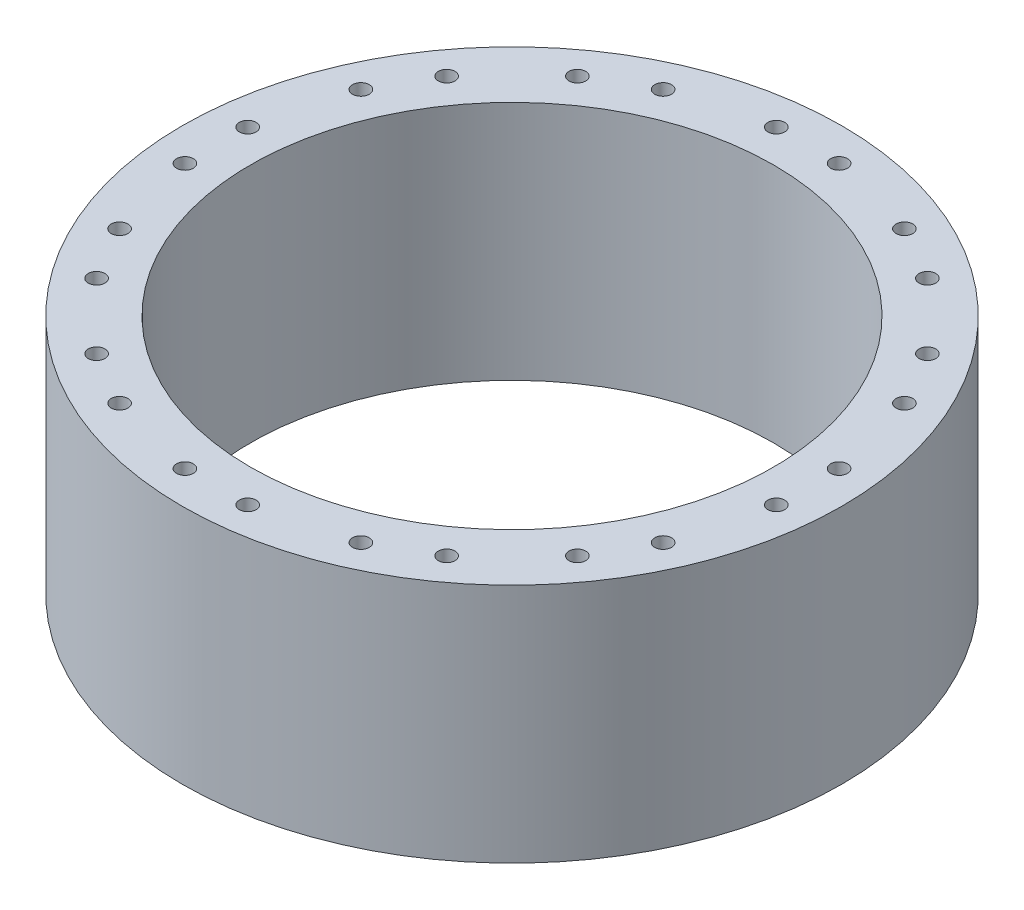
ISO-10303-21;
HEADER;
FILE_DESCRIPTION(('STEP AP214'),'2;1');
FILE_NAME('part.step','',(''),(''),'','','');
FILE_SCHEMA(('AUTOMOTIVE_DESIGN { 1 0 10303 214 1 1 1 1 }'));
ENDSEC;
DATA;
#1=APPLICATION_CONTEXT('core data for automotive mechanical design processes');
#2=APPLICATION_PROTOCOL_DEFINITION('international standard','automotive_design',2000,#1);
#3=PRODUCT_CONTEXT('',#1,'mechanical');
#4=PRODUCT('Part','Part','',(#3));
#5=PRODUCT_RELATED_PRODUCT_CATEGORY('part','',(#4));
#6=PRODUCT_DEFINITION_FORMATION('','',#4);
#7=PRODUCT_DEFINITION_CONTEXT('part definition',#1,'design');
#8=PRODUCT_DEFINITION('design','',#6,#7);
#9=PRODUCT_DEFINITION_SHAPE('','',#8);
#10=(LENGTH_UNIT() NAMED_UNIT(*) SI_UNIT(.MILLI.,.METRE.));
#11=(NAMED_UNIT(*) PLANE_ANGLE_UNIT() SI_UNIT($,.RADIAN.));
#12=(NAMED_UNIT(*) SI_UNIT($,.STERADIAN.) SOLID_ANGLE_UNIT());
#13=UNCERTAINTY_MEASURE_WITH_UNIT(LENGTH_MEASURE(1.E-05),#10,'distance_accuracy_value','');
#14=(GEOMETRIC_REPRESENTATION_CONTEXT(3) GLOBAL_UNCERTAINTY_ASSIGNED_CONTEXT((#13)) GLOBAL_UNIT_ASSIGNED_CONTEXT((#10,
#11,#12)) REPRESENTATION_CONTEXT('',''));
#15=CARTESIAN_POINT('',(0.,0.,0.));
#16=DIRECTION('',(0.,0.,1.));
#17=DIRECTION('',(1.,0.,0.));
#18=AXIS2_PLACEMENT_3D('',#15,#16,#17);
#19=CARTESIAN_POINT('',(0.,105.,0.));
#20=DIRECTION('',(0.,1.,0.));
#21=DIRECTION('',(0.,0.,1.));
#22=AXIS2_PLACEMENT_3D('',#19,#20,#21);
#23=PLANE('',#22);
#24=CARTESIAN_POINT('',(-83.6153810567697,105.,-114.82608828455));
#25=DIRECTION('',(0.,-1.,0.));
#26=DIRECTION('',(0.500000000000001,0.,0.866025403784438));
#27=AXIS2_PLACEMENT_3D('',#24,#25,#26);
#28=CIRCLE('',#27,4.00000000000001);
#29=CARTESIAN_POINT('',(-81.6153810567697,105.,-111.361986669412));
#30=VERTEX_POINT('',#29);
#31=EDGE_CURVE('E71',#30,#30,#28,.T.);
#32=ORIENTED_EDGE('',*,*,#31,.T.);
#33=EDGE_LOOP('',(#32));
#34=FACE_BOUND('',#33,.T.);
#35=CARTESIAN_POINT('',(-114.826088284554,105.,-83.6153810567633));
#36=DIRECTION('',(0.,-1.,0.));
#37=DIRECTION('',(-0.86602540378444,0.,-0.499999999999998));
#38=AXIS2_PLACEMENT_3D('',#35,#36,#37);
#39=CIRCLE('',#38,4.00000000000001);
#40=CARTESIAN_POINT('',(-118.290189899692,105.,-85.6153810567633));
#41=VERTEX_POINT('',#40);
#42=EDGE_CURVE('E162',#41,#41,#39,.T.);
#43=ORIENTED_EDGE('',*,*,#42,.T.);
#44=EDGE_LOOP('',(#43));
#45=FACE_BOUND('',#44,.T.);
#46=CARTESIAN_POINT('',(-129.826088284554,105.,-57.6346189432301));
#47=DIRECTION('',(0.,-1.,0.));
#48=DIRECTION('',(0.86602540378444,0.,0.499999999999998));
#49=AXIS2_PLACEMENT_3D('',#46,#47,#48);
#50=CIRCLE('',#49,4.00000000000001);
#51=CARTESIAN_POINT('',(-126.361986669416,105.,-55.6346189432302));
#52=VERTEX_POINT('',#51);
#53=EDGE_CURVE('E156',#52,#52,#50,.T.);
#54=ORIENTED_EDGE('',*,*,#53,.T.);
#55=EDGE_LOOP('',(#54));
#56=FACE_BOUND('',#55,.T.);
#57=CARTESIAN_POINT('',(-141.25,105.,-14.9999999999961));
#58=DIRECTION('',(0.,-1.,0.));
#59=DIRECTION('',(-1.,0.,0.));
#60=AXIS2_PLACEMENT_3D('',#57,#58,#59);
#61=CIRCLE('',#60,4.00000000000001);
#62=CARTESIAN_POINT('',(-145.25,105.,-14.9999999999961));
#63=VERTEX_POINT('',#62);
#64=EDGE_CURVE('E150',#63,#63,#61,.T.);
#65=ORIENTED_EDGE('',*,*,#64,.T.);
#66=EDGE_LOOP('',(#65));
#67=FACE_BOUND('',#66,.T.);
#68=CARTESIAN_POINT('',(-141.25,105.,15.0000000000039));
#69=DIRECTION('',(0.,-1.,0.));
#70=DIRECTION('',(1.,0.,0.));
#71=AXIS2_PLACEMENT_3D('',#68,#69,#70);
#72=CIRCLE('',#71,4.00000000000001);
#73=CARTESIAN_POINT('',(-137.25,105.,15.0000000000039));
#74=VERTEX_POINT('',#73);
#75=EDGE_CURVE('E144',#74,#74,#72,.T.);
#76=ORIENTED_EDGE('',*,*,#75,.T.);
#77=EDGE_LOOP('',(#76));
#78=FACE_BOUND('',#77,.T.);
#79=CARTESIAN_POINT('',(-129.82608828455,105.,57.634618943237));
#80=DIRECTION('',(0.,-1.,0.));
#81=DIRECTION('',(-0.866025403784436,0.,0.500000000000004));
#82=AXIS2_PLACEMENT_3D('',#79,#80,#81);
#83=CIRCLE('',#82,4.00000000000001);
#84=CARTESIAN_POINT('',(-133.290189899688,105.,59.634618943237));
#85=VERTEX_POINT('',#84);
#86=EDGE_CURVE('E138',#85,#85,#83,.T.);
#87=ORIENTED_EDGE('',*,*,#86,.T.);
#88=EDGE_LOOP('',(#87));
#89=FACE_BOUND('',#88,.T.);
#90=CARTESIAN_POINT('',(-114.82608828455,105.,83.6153810567701));
#91=DIRECTION('',(0.,-1.,0.));
#92=DIRECTION('',(0.866025403784436,0.,-0.500000000000004));
#93=AXIS2_PLACEMENT_3D('',#90,#91,#92);
#94=CIRCLE('',#93,4.00000000000001);
#95=CARTESIAN_POINT('',(-111.361986669412,105.,81.6153810567701));
#96=VERTEX_POINT('',#95);
#97=EDGE_CURVE('E132',#96,#96,#94,.T.);
#98=ORIENTED_EDGE('',*,*,#97,.T.);
#99=EDGE_LOOP('',(#98));
#100=FACE_BOUND('',#99,.T.);
#101=CARTESIAN_POINT('',(-83.6153810567629,105.,114.826088284554));
#102=DIRECTION('',(0.,-1.,0.));
#103=DIRECTION('',(-0.499999999999995,0.,0.866025403784442));
#104=AXIS2_PLACEMENT_3D('',#101,#102,#103);
#105=CIRCLE('',#104,4.00000000000001);
#106=CARTESIAN_POINT('',(-85.6153810567629,105.,118.290189899692));
#107=VERTEX_POINT('',#106);
#108=EDGE_CURVE('E126',#107,#107,#105,.T.);
#109=ORIENTED_EDGE('',*,*,#108,.T.);
#110=EDGE_LOOP('',(#109));
#111=FACE_BOUND('',#110,.T.);
#112=CARTESIAN_POINT('',(-57.6346189432297,105.,129.826088284554));
#113=DIRECTION('',(0.,-1.,0.));
#114=DIRECTION('',(0.499999999999995,0.,-0.866025403784442));
#115=AXIS2_PLACEMENT_3D('',#112,#113,#114);
#116=CIRCLE('',#115,4.00000000000001);
#117=CARTESIAN_POINT('',(-55.6346189432297,105.,126.361986669416));
#118=VERTEX_POINT('',#117);
#119=EDGE_CURVE('E120',#118,#118,#116,.T.);
#120=ORIENTED_EDGE('',*,*,#119,.T.);
#121=EDGE_LOOP('',(#120));
#122=FACE_BOUND('',#121,.T.);
#123=CARTESIAN_POINT('',(-14.9999999999966,105.,141.25));
#124=DIRECTION('',(0.,-1.,0.));
#125=DIRECTION('',(0.,0.,1.));
#126=AXIS2_PLACEMENT_3D('',#123,#124,#125);
#127=CIRCLE('',#126,4.00000000000001);
#128=CARTESIAN_POINT('',(-14.9999999999966,105.,145.25));
#129=VERTEX_POINT('',#128);
#130=EDGE_CURVE('E114',#129,#129,#127,.T.);
#131=ORIENTED_EDGE('',*,*,#130,.T.);
#132=EDGE_LOOP('',(#131));
#133=FACE_BOUND('',#132,.T.);
#134=CARTESIAN_POINT('',(15.0000000000034,105.,141.25));
#135=DIRECTION('',(0.,-1.,0.));
#136=DIRECTION('',(0.,0.,-1.));
#137=AXIS2_PLACEMENT_3D('',#134,#135,#136);
#138=CIRCLE('',#137,4.00000000000001);
#139=CARTESIAN_POINT('',(15.0000000000034,105.,137.25));
#140=VERTEX_POINT('',#139);
#141=EDGE_CURVE('E108',#140,#140,#138,.T.);
#142=ORIENTED_EDGE('',*,*,#141,.T.);
#143=EDGE_LOOP('',(#142));
#144=FACE_BOUND('',#143,.T.);
#145=CARTESIAN_POINT('',(57.6346189432374,105.,129.82608828455));
#146=DIRECTION('',(0.,-1.,0.));
#147=DIRECTION('',(0.500000000000007,0.,0.866025403784435));
#148=AXIS2_PLACEMENT_3D('',#145,#146,#147);
#149=CIRCLE('',#148,4.00000000000001);
#150=CARTESIAN_POINT('',(59.6346189432375,105.,133.290189899688));
#151=VERTEX_POINT('',#150);
#152=EDGE_CURVE('E102',#151,#151,#149,.T.);
#153=ORIENTED_EDGE('',*,*,#152,.T.);
#154=EDGE_LOOP('',(#153));
#155=FACE_BOUND('',#154,.T.);
#156=CARTESIAN_POINT('',(83.6153810567705,105.,114.82608828455));
#157=DIRECTION('',(0.,-1.,0.));
#158=DIRECTION('',(-0.500000000000007,0.,-0.866025403784435));
#159=AXIS2_PLACEMENT_3D('',#156,#157,#158);
#160=CIRCLE('',#159,4.00000000000001);
#161=CARTESIAN_POINT('',(81.6153810567704,105.,111.361986669412));
#162=VERTEX_POINT('',#161);
#163=EDGE_CURVE('E96',#162,#162,#160,.T.);
#164=ORIENTED_EDGE('',*,*,#163,.T.);
#165=EDGE_LOOP('',(#164));
#166=FACE_BOUND('',#165,.T.);
#167=CARTESIAN_POINT('',(114.826088284554,105.,83.6153810567625));
#168=DIRECTION('',(0.,-1.,0.));
#169=DIRECTION('',(0.866025403784443,0.,0.499999999999992));
#170=AXIS2_PLACEMENT_3D('',#167,#168,#169);
#171=CIRCLE('',#170,4.00000000000001);
#172=CARTESIAN_POINT('',(118.290189899692,105.,85.6153810567625));
#173=VERTEX_POINT('',#172);
#174=EDGE_CURVE('E90',#173,#173,#171,.T.);
#175=ORIENTED_EDGE('',*,*,#174,.T.);
#176=EDGE_LOOP('',(#175));
#177=FACE_BOUND('',#176,.T.);
#178=CARTESIAN_POINT('',(129.826088284554,105.,57.6346189432292));
#179=DIRECTION('',(0.,-1.,0.));
#180=DIRECTION('',(-0.866025403784443,0.,-0.499999999999992));
#181=AXIS2_PLACEMENT_3D('',#178,#179,#180);
#182=CIRCLE('',#181,4.00000000000001);
#183=CARTESIAN_POINT('',(126.361986669416,105.,55.6346189432293));
#184=VERTEX_POINT('',#183);
#185=EDGE_CURVE('E84',#184,#184,#182,.T.);
#186=ORIENTED_EDGE('',*,*,#185,.T.);
#187=EDGE_LOOP('',(#186));
#188=FACE_BOUND('',#187,.T.);
#189=CARTESIAN_POINT('',(141.25,105.,14.9999999999951));
#190=DIRECTION('',(0.,-1.,0.));
#191=DIRECTION('',(1.,0.,0.));
#192=AXIS2_PLACEMENT_3D('',#189,#190,#191);
#193=CIRCLE('',#192,4.00000000000001);
#194=CARTESIAN_POINT('',(145.25,105.,14.999999999995));
#195=VERTEX_POINT('',#194);
#196=EDGE_CURVE('E77',#195,#195,#193,.T.);
#197=ORIENTED_EDGE('',*,*,#196,.T.);
#198=EDGE_LOOP('',(#197));
#199=FACE_BOUND('',#198,.T.);
#200=CARTESIAN_POINT('',(141.25,105.,-15.0000000000049));
#201=DIRECTION('',(0.,-1.,0.));
#202=DIRECTION('',(-1.,0.,0.));
#203=AXIS2_PLACEMENT_3D('',#200,#201,#202);
#204=CIRCLE('',#203,4.00000000000001);
#205=CARTESIAN_POINT('',(137.25,105.,-15.0000000000049));
#206=VERTEX_POINT('',#205);
#207=EDGE_CURVE('E78',#206,#206,#204,.T.);
#208=ORIENTED_EDGE('',*,*,#207,.T.);
#209=EDGE_LOOP('',(#208));
#210=FACE_BOUND('',#209,.T.);
#211=CARTESIAN_POINT('',(129.82608828455,105.,-57.6346189432379));
#212=DIRECTION('',(0.,-1.,0.));
#213=DIRECTION('',(0.866025403784433,0.,-0.50000000000001));
#214=AXIS2_PLACEMENT_3D('',#211,#212,#213);
#215=CIRCLE('',#214,4.00000000000001);
#216=CARTESIAN_POINT('',(133.290189899687,105.,-59.6346189432379));
#217=VERTEX_POINT('',#216);
#218=EDGE_CURVE('E191',#217,#217,#215,.T.);
#219=ORIENTED_EDGE('',*,*,#218,.T.);
#220=EDGE_LOOP('',(#219));
#221=FACE_BOUND('',#220,.T.);
#222=CARTESIAN_POINT('',(114.826088284549,105.,-83.6153810567709));
#223=DIRECTION('',(0.,-1.,0.));
#224=DIRECTION('',(-0.866025403784433,0.,0.50000000000001));
#225=AXIS2_PLACEMENT_3D('',#222,#223,#224);
#226=CIRCLE('',#225,4.00000000000001);
#227=CARTESIAN_POINT('',(111.361986669412,105.,-81.6153810567708));
#228=VERTEX_POINT('',#227);
#229=EDGE_CURVE('E185',#228,#228,#226,.T.);
#230=ORIENTED_EDGE('',*,*,#229,.T.);
#231=EDGE_LOOP('',(#230));
#232=FACE_BOUND('',#231,.T.);
#233=CARTESIAN_POINT('',(83.6153810567621,105.,-114.826088284555));
#234=DIRECTION('',(0.,-1.,0.));
#235=DIRECTION('',(0.499999999999989,0.,-0.866025403784445));
#236=AXIS2_PLACEMENT_3D('',#233,#234,#235);
#237=CIRCLE('',#236,4.00000000000001);
#238=CARTESIAN_POINT('',(85.6153810567621,105.,-118.290189899693));
#239=VERTEX_POINT('',#238);
#240=EDGE_CURVE('E179',#239,#239,#237,.T.);
#241=ORIENTED_EDGE('',*,*,#240,.T.);
#242=EDGE_LOOP('',(#241));
#243=FACE_BOUND('',#242,.T.);
#244=CARTESIAN_POINT('',(57.6346189432288,105.,-129.826088284554));
#245=DIRECTION('',(0.,-1.,0.));
#246=DIRECTION('',(-0.499999999999989,0.,0.866025403784445));
#247=AXIS2_PLACEMENT_3D('',#244,#245,#246);
#248=CIRCLE('',#247,4.00000000000001);
#249=CARTESIAN_POINT('',(55.6346189432288,105.,-126.361986669417));
#250=VERTEX_POINT('',#249);
#251=EDGE_CURVE('E173',#250,#250,#248,.T.);
#252=ORIENTED_EDGE('',*,*,#251,.T.);
#253=EDGE_LOOP('',(#252));
#254=FACE_BOUND('',#253,.T.);
#255=CARTESIAN_POINT('',(-57.6346189432365,105.,-129.82608828455));
#256=DIRECTION('',(0.,-1.,0.));
#257=DIRECTION('',(-0.500000000000001,0.,-0.866025403784438));
#258=AXIS2_PLACEMENT_3D('',#255,#256,#257);
#259=CIRCLE('',#258,4.00000000000001);
#260=CARTESIAN_POINT('',(-59.6346189432365,105.,-133.290189899688));
#261=VERTEX_POINT('',#260);
#262=EDGE_CURVE('E60',#261,#261,#259,.T.);
#263=ORIENTED_EDGE('',*,*,#262,.T.);
#264=EDGE_LOOP('',(#263));
#265=FACE_BOUND('',#264,.T.);
#266=CARTESIAN_POINT('',(14.9999999999966,105.,-141.25));
#267=DIRECTION('',(0.,-1.,0.));
#268=DIRECTION('',(0.,0.,-1.));
#269=AXIS2_PLACEMENT_3D('',#266,#267,#268);
#270=CIRCLE('',#269,4.00000000000001);
#271=CARTESIAN_POINT('',(14.9999999999966,105.,-145.25));
#272=VERTEX_POINT('',#271);
#273=EDGE_CURVE('E55',#272,#272,#270,.T.);
#274=ORIENTED_EDGE('',*,*,#273,.T.);
#275=EDGE_LOOP('',(#274));
#276=FACE_BOUND('',#275,.T.);
#277=CARTESIAN_POINT('',(-15.0000000000034,105.,-141.25));
#278=DIRECTION('',(0.,-1.,0.));
#279=DIRECTION('',(0.,0.,1.));
#280=AXIS2_PLACEMENT_3D('',#277,#278,#279);
#281=CIRCLE('',#280,4.00000000000001);
#282=CARTESIAN_POINT('',(-15.0000000000034,105.,-137.25));
#283=VERTEX_POINT('',#282);
#284=EDGE_CURVE('E59',#283,#283,#281,.T.);
#285=ORIENTED_EDGE('',*,*,#284,.T.);
#286=EDGE_LOOP('',(#285));
#287=FACE_BOUND('',#286,.T.);
#288=CARTESIAN_POINT('',(0.,105.,0.));
#289=DIRECTION('',(0.,1.,0.));
#290=DIRECTION('',(0.,0.,1.));
#291=AXIS2_PLACEMENT_3D('',#288,#289,#290);
#292=CIRCLE('',#291,157.5);
#293=CARTESIAN_POINT('',(0.,105.,157.5));
#294=VERTEX_POINT('',#293);
#295=EDGE_CURVE('E10',#294,#294,#292,.T.);
#296=ORIENTED_EDGE('',*,*,#295,.T.);
#297=EDGE_LOOP('',(#296));
#298=FACE_BOUND('',#297,.T.);
#299=CARTESIAN_POINT('',(0.,105.,0.));
#300=DIRECTION('',(0.,1.,0.));
#301=DIRECTION('',(0.,0.,1.));
#302=AXIS2_PLACEMENT_3D('',#299,#300,#301);
#303=CIRCLE('',#302,125.);
#304=CARTESIAN_POINT('',(0.,105.,125.));
#305=VERTEX_POINT('',#304);
#306=EDGE_CURVE('E42',#305,#305,#303,.T.);
#307=ORIENTED_EDGE('',*,*,#306,.F.);
#308=EDGE_LOOP('',(#307));
#309=FACE_BOUND('',#308,.T.);
#310=ADVANCED_FACE('F35',(#34,#45,#56,#67,#78,#89,#100,#111,#122,#133,#144,#155,#166,#177,#188,
#199,#210,#221,#232,#243,#254,#265,#276,#287,#298,#309),#23,.T.);
#311=CARTESIAN_POINT('',(0.,105.,0.));
#312=DIRECTION('',(0.,-1.,0.));
#313=DIRECTION('',(0.,0.,-1.));
#314=AXIS2_PLACEMENT_3D('',#311,#312,#313);
#315=CYLINDRICAL_SURFACE('',#314,157.5);
#316=ORIENTED_EDGE('',*,*,#295,.F.);
#317=EDGE_LOOP('',(#316));
#318=FACE_BOUND('',#317,.T.);
#319=CARTESIAN_POINT('',(0.,-10.,0.));
#320=DIRECTION('',(0.,1.,0.));
#321=DIRECTION('',(0.,0.,1.));
#322=AXIS2_PLACEMENT_3D('',#319,#320,#321);
#323=CIRCLE('',#322,157.5);
#324=CARTESIAN_POINT('',(0.,-10.,157.5));
#325=VERTEX_POINT('',#324);
#326=EDGE_CURVE('E46',#325,#325,#323,.T.);
#327=ORIENTED_EDGE('',*,*,#326,.T.);
#328=EDGE_LOOP('',(#327));
#329=FACE_BOUND('',#328,.T.);
#330=ADVANCED_FACE('F37',(#318,#329),#315,.T.);
#331=CARTESIAN_POINT('',(0.,105.,0.));
#332=DIRECTION('',(0.,-1.,0.));
#333=DIRECTION('',(0.,0.,-1.));
#334=AXIS2_PLACEMENT_3D('',#331,#332,#333);
#335=CYLINDRICAL_SURFACE('',#334,125.);
#336=ORIENTED_EDGE('',*,*,#306,.T.);
#337=EDGE_LOOP('',(#336));
#338=FACE_BOUND('',#337,.T.);
#339=CARTESIAN_POINT('',(0.,-10.,0.));
#340=DIRECTION('',(0.,1.,0.));
#341=DIRECTION('',(0.,0.,1.));
#342=AXIS2_PLACEMENT_3D('',#339,#340,#341);
#343=CIRCLE('',#342,125.);
#344=CARTESIAN_POINT('',(0.,-10.,125.));
#345=VERTEX_POINT('',#344);
#346=EDGE_CURVE('E50',#345,#345,#343,.T.);
#347=ORIENTED_EDGE('',*,*,#346,.F.);
#348=EDGE_LOOP('',(#347));
#349=FACE_BOUND('',#348,.T.);
#350=ADVANCED_FACE('F214',(#338,#349),#335,.F.);
#351=CARTESIAN_POINT('',(0.,-10.,0.));
#352=DIRECTION('',(0.,1.,0.));
#353=DIRECTION('',(0.,0.,1.));
#354=AXIS2_PLACEMENT_3D('',#351,#352,#353);
#355=PLANE('',#354);
#356=CARTESIAN_POINT('',(-83.6153810567697,-10.,-114.82608828455));
#357=DIRECTION('',(0.,-1.,0.));
#358=DIRECTION('',(0.500000000000001,0.,0.866025403784438));
#359=AXIS2_PLACEMENT_3D('',#356,#357,#358);
#360=CIRCLE('',#359,4.00000000000001);
#361=CARTESIAN_POINT('',(-81.6153810567697,-10.,-111.361986669412));
#362=VERTEX_POINT('',#361);
#363=EDGE_CURVE('E165',#362,#362,#360,.T.);
#364=ORIENTED_EDGE('',*,*,#363,.F.);
#365=EDGE_LOOP('',(#364));
#366=FACE_BOUND('',#365,.T.);
#367=CARTESIAN_POINT('',(-114.826088284554,-10.,-83.6153810567633));
#368=DIRECTION('',(0.,-1.,0.));
#369=DIRECTION('',(-0.86602540378444,0.,-0.499999999999998));
#370=AXIS2_PLACEMENT_3D('',#367,#368,#369);
#371=CIRCLE('',#370,4.00000000000001);
#372=CARTESIAN_POINT('',(-118.290189899692,-10.,-85.6153810567633));
#373=VERTEX_POINT('',#372);
#374=EDGE_CURVE('E159',#373,#373,#371,.T.);
#375=ORIENTED_EDGE('',*,*,#374,.F.);
#376=EDGE_LOOP('',(#375));
#377=FACE_BOUND('',#376,.T.);
#378=CARTESIAN_POINT('',(-129.826088284554,-10.,-57.6346189432301));
#379=DIRECTION('',(0.,-1.,0.));
#380=DIRECTION('',(0.86602540378444,0.,0.499999999999998));
#381=AXIS2_PLACEMENT_3D('',#378,#379,#380);
#382=CIRCLE('',#381,4.00000000000001);
#383=CARTESIAN_POINT('',(-126.361986669416,-10.,-55.6346189432302));
#384=VERTEX_POINT('',#383);
#385=EDGE_CURVE('E153',#384,#384,#382,.T.);
#386=ORIENTED_EDGE('',*,*,#385,.F.);
#387=EDGE_LOOP('',(#386));
#388=FACE_BOUND('',#387,.T.);
#389=CARTESIAN_POINT('',(-141.25,-10.,-14.9999999999961));
#390=DIRECTION('',(0.,-1.,0.));
#391=DIRECTION('',(-1.,0.,0.));
#392=AXIS2_PLACEMENT_3D('',#389,#390,#391);
#393=CIRCLE('',#392,4.00000000000001);
#394=CARTESIAN_POINT('',(-145.25,-10.,-14.9999999999961));
#395=VERTEX_POINT('',#394);
#396=EDGE_CURVE('E147',#395,#395,#393,.T.);
#397=ORIENTED_EDGE('',*,*,#396,.F.);
#398=EDGE_LOOP('',(#397));
#399=FACE_BOUND('',#398,.T.);
#400=CARTESIAN_POINT('',(-141.25,-10.,15.0000000000039));
#401=DIRECTION('',(0.,-1.,0.));
#402=DIRECTION('',(1.,0.,0.));
#403=AXIS2_PLACEMENT_3D('',#400,#401,#402);
#404=CIRCLE('',#403,4.00000000000001);
#405=CARTESIAN_POINT('',(-137.25,-10.,15.0000000000039));
#406=VERTEX_POINT('',#405);
#407=EDGE_CURVE('E141',#406,#406,#404,.T.);
#408=ORIENTED_EDGE('',*,*,#407,.F.);
#409=EDGE_LOOP('',(#408));
#410=FACE_BOUND('',#409,.T.);
#411=CARTESIAN_POINT('',(-129.82608828455,-10.,57.634618943237));
#412=DIRECTION('',(0.,-1.,0.));
#413=DIRECTION('',(-0.866025403784436,0.,0.500000000000004));
#414=AXIS2_PLACEMENT_3D('',#411,#412,#413);
#415=CIRCLE('',#414,4.00000000000001);
#416=CARTESIAN_POINT('',(-133.290189899688,-10.,59.634618943237));
#417=VERTEX_POINT('',#416);
#418=EDGE_CURVE('E135',#417,#417,#415,.T.);
#419=ORIENTED_EDGE('',*,*,#418,.F.);
#420=EDGE_LOOP('',(#419));
#421=FACE_BOUND('',#420,.T.);
#422=CARTESIAN_POINT('',(-114.82608828455,-10.,83.6153810567701));
#423=DIRECTION('',(0.,-1.,0.));
#424=DIRECTION('',(0.866025403784436,0.,-0.500000000000004));
#425=AXIS2_PLACEMENT_3D('',#422,#423,#424);
#426=CIRCLE('',#425,4.00000000000001);
#427=CARTESIAN_POINT('',(-111.361986669412,-10.,81.6153810567701));
#428=VERTEX_POINT('',#427);
#429=EDGE_CURVE('E129',#428,#428,#426,.T.);
#430=ORIENTED_EDGE('',*,*,#429,.F.);
#431=EDGE_LOOP('',(#430));
#432=FACE_BOUND('',#431,.T.);
#433=CARTESIAN_POINT('',(-83.6153810567629,-10.,114.826088284554));
#434=DIRECTION('',(0.,-1.,0.));
#435=DIRECTION('',(-0.499999999999995,0.,0.866025403784442));
#436=AXIS2_PLACEMENT_3D('',#433,#434,#435);
#437=CIRCLE('',#436,4.00000000000001);
#438=CARTESIAN_POINT('',(-85.6153810567629,-10.,118.290189899692));
#439=VERTEX_POINT('',#438);
#440=EDGE_CURVE('E123',#439,#439,#437,.T.);
#441=ORIENTED_EDGE('',*,*,#440,.F.);
#442=EDGE_LOOP('',(#441));
#443=FACE_BOUND('',#442,.T.);
#444=CARTESIAN_POINT('',(-57.6346189432297,-10.,129.826088284554));
#445=DIRECTION('',(0.,-1.,0.));
#446=DIRECTION('',(0.499999999999995,0.,-0.866025403784442));
#447=AXIS2_PLACEMENT_3D('',#444,#445,#446);
#448=CIRCLE('',#447,4.00000000000001);
#449=CARTESIAN_POINT('',(-55.6346189432297,-10.,126.361986669416));
#450=VERTEX_POINT('',#449);
#451=EDGE_CURVE('E117',#450,#450,#448,.T.);
#452=ORIENTED_EDGE('',*,*,#451,.F.);
#453=EDGE_LOOP('',(#452));
#454=FACE_BOUND('',#453,.T.);
#455=CARTESIAN_POINT('',(-14.9999999999966,-10.,141.25));
#456=DIRECTION('',(0.,-1.,0.));
#457=DIRECTION('',(0.,0.,1.));
#458=AXIS2_PLACEMENT_3D('',#455,#456,#457);
#459=CIRCLE('',#458,4.00000000000001);
#460=CARTESIAN_POINT('',(-14.9999999999966,-10.,145.25));
#461=VERTEX_POINT('',#460);
#462=EDGE_CURVE('E111',#461,#461,#459,.T.);
#463=ORIENTED_EDGE('',*,*,#462,.F.);
#464=EDGE_LOOP('',(#463));
#465=FACE_BOUND('',#464,.T.);
#466=CARTESIAN_POINT('',(15.0000000000034,-10.,141.25));
#467=DIRECTION('',(0.,-1.,0.));
#468=DIRECTION('',(0.,0.,-1.));
#469=AXIS2_PLACEMENT_3D('',#466,#467,#468);
#470=CIRCLE('',#469,4.00000000000001);
#471=CARTESIAN_POINT('',(15.0000000000034,-10.,137.25));
#472=VERTEX_POINT('',#471);
#473=EDGE_CURVE('E105',#472,#472,#470,.T.);
#474=ORIENTED_EDGE('',*,*,#473,.F.);
#475=EDGE_LOOP('',(#474));
#476=FACE_BOUND('',#475,.T.);
#477=CARTESIAN_POINT('',(57.6346189432374,-10.,129.82608828455));
#478=DIRECTION('',(0.,-1.,0.));
#479=DIRECTION('',(0.500000000000007,0.,0.866025403784435));
#480=AXIS2_PLACEMENT_3D('',#477,#478,#479);
#481=CIRCLE('',#480,4.00000000000001);
#482=CARTESIAN_POINT('',(59.6346189432375,-10.,133.290189899688));
#483=VERTEX_POINT('',#482);
#484=EDGE_CURVE('E99',#483,#483,#481,.T.);
#485=ORIENTED_EDGE('',*,*,#484,.F.);
#486=EDGE_LOOP('',(#485));
#487=FACE_BOUND('',#486,.T.);
#488=CARTESIAN_POINT('',(83.6153810567705,-10.,114.82608828455));
#489=DIRECTION('',(0.,-1.,0.));
#490=DIRECTION('',(-0.500000000000007,0.,-0.866025403784435));
#491=AXIS2_PLACEMENT_3D('',#488,#489,#490);
#492=CIRCLE('',#491,4.00000000000001);
#493=CARTESIAN_POINT('',(81.6153810567704,-10.,111.361986669412));
#494=VERTEX_POINT('',#493);
#495=EDGE_CURVE('E93',#494,#494,#492,.T.);
#496=ORIENTED_EDGE('',*,*,#495,.F.);
#497=EDGE_LOOP('',(#496));
#498=FACE_BOUND('',#497,.T.);
#499=CARTESIAN_POINT('',(114.826088284554,-10.,83.6153810567625));
#500=DIRECTION('',(0.,-1.,0.));
#501=DIRECTION('',(0.866025403784443,0.,0.499999999999992));
#502=AXIS2_PLACEMENT_3D('',#499,#500,#501);
#503=CIRCLE('',#502,4.00000000000001);
#504=CARTESIAN_POINT('',(118.290189899692,-10.,85.6153810567625));
#505=VERTEX_POINT('',#504);
#506=EDGE_CURVE('E87',#505,#505,#503,.T.);
#507=ORIENTED_EDGE('',*,*,#506,.F.);
#508=EDGE_LOOP('',(#507));
#509=FACE_BOUND('',#508,.T.);
#510=CARTESIAN_POINT('',(129.826088284554,-10.,57.6346189432292));
#511=DIRECTION('',(0.,-1.,0.));
#512=DIRECTION('',(-0.866025403784443,0.,-0.499999999999992));
#513=AXIS2_PLACEMENT_3D('',#510,#511,#512);
#514=CIRCLE('',#513,4.00000000000001);
#515=CARTESIAN_POINT('',(126.361986669416,-10.,55.6346189432293));
#516=VERTEX_POINT('',#515);
#517=EDGE_CURVE('E81',#516,#516,#514,.T.);
#518=ORIENTED_EDGE('',*,*,#517,.F.);
#519=EDGE_LOOP('',(#518));
#520=FACE_BOUND('',#519,.T.);
#521=CARTESIAN_POINT('',(141.25,-10.,14.9999999999951));
#522=DIRECTION('',(0.,-1.,0.));
#523=DIRECTION('',(1.,0.,0.));
#524=AXIS2_PLACEMENT_3D('',#521,#522,#523);
#525=CIRCLE('',#524,4.00000000000001);
#526=CARTESIAN_POINT('',(145.25,-10.,14.999999999995));
#527=VERTEX_POINT('',#526);
#528=EDGE_CURVE('E74',#527,#527,#525,.T.);
#529=ORIENTED_EDGE('',*,*,#528,.F.);
#530=EDGE_LOOP('',(#529));
#531=FACE_BOUND('',#530,.T.);
#532=CARTESIAN_POINT('',(141.25,-10.,-15.0000000000049));
#533=DIRECTION('',(0.,-1.,0.));
#534=DIRECTION('',(-1.,0.,0.));
#535=AXIS2_PLACEMENT_3D('',#532,#533,#534);
#536=CIRCLE('',#535,4.00000000000001);
#537=CARTESIAN_POINT('',(137.25,-10.,-15.0000000000049));
#538=VERTEX_POINT('',#537);
#539=EDGE_CURVE('E194',#538,#538,#536,.T.);
#540=ORIENTED_EDGE('',*,*,#539,.F.);
#541=EDGE_LOOP('',(#540));
#542=FACE_BOUND('',#541,.T.);
#543=CARTESIAN_POINT('',(129.82608828455,-10.,-57.6346189432379));
#544=DIRECTION('',(0.,-1.,0.));
#545=DIRECTION('',(0.866025403784433,0.,-0.50000000000001));
#546=AXIS2_PLACEMENT_3D('',#543,#544,#545);
#547=CIRCLE('',#546,4.00000000000001);
#548=CARTESIAN_POINT('',(133.290189899687,-10.,-59.6346189432379));
#549=VERTEX_POINT('',#548);
#550=EDGE_CURVE('E188',#549,#549,#547,.T.);
#551=ORIENTED_EDGE('',*,*,#550,.F.);
#552=EDGE_LOOP('',(#551));
#553=FACE_BOUND('',#552,.T.);
#554=CARTESIAN_POINT('',(114.826088284549,-10.,-83.6153810567709));
#555=DIRECTION('',(0.,-1.,0.));
#556=DIRECTION('',(-0.866025403784433,0.,0.50000000000001));
#557=AXIS2_PLACEMENT_3D('',#554,#555,#556);
#558=CIRCLE('',#557,4.00000000000001);
#559=CARTESIAN_POINT('',(111.361986669412,-10.,-81.6153810567708));
#560=VERTEX_POINT('',#559);
#561=EDGE_CURVE('E182',#560,#560,#558,.T.);
#562=ORIENTED_EDGE('',*,*,#561,.F.);
#563=EDGE_LOOP('',(#562));
#564=FACE_BOUND('',#563,.T.);
#565=CARTESIAN_POINT('',(83.6153810567621,-10.,-114.826088284555));
#566=DIRECTION('',(0.,-1.,0.));
#567=DIRECTION('',(0.499999999999989,0.,-0.866025403784445));
#568=AXIS2_PLACEMENT_3D('',#565,#566,#567);
#569=CIRCLE('',#568,4.00000000000001);
#570=CARTESIAN_POINT('',(85.6153810567621,-10.,-118.290189899693));
#571=VERTEX_POINT('',#570);
#572=EDGE_CURVE('E176',#571,#571,#569,.T.);
#573=ORIENTED_EDGE('',*,*,#572,.F.);
#574=EDGE_LOOP('',(#573));
#575=FACE_BOUND('',#574,.T.);
#576=CARTESIAN_POINT('',(57.6346189432288,-10.,-129.826088284554));
#577=DIRECTION('',(0.,-1.,0.));
#578=DIRECTION('',(-0.499999999999989,0.,0.866025403784445));
#579=AXIS2_PLACEMENT_3D('',#576,#577,#578);
#580=CIRCLE('',#579,4.00000000000001);
#581=CARTESIAN_POINT('',(55.6346189432288,-10.,-126.361986669417));
#582=VERTEX_POINT('',#581);
#583=EDGE_CURVE('E170',#582,#582,#580,.T.);
#584=ORIENTED_EDGE('',*,*,#583,.F.);
#585=EDGE_LOOP('',(#584));
#586=FACE_BOUND('',#585,.T.);
#587=CARTESIAN_POINT('',(-57.6346189432365,-10.,-129.82608828455));
#588=DIRECTION('',(0.,-1.,0.));
#589=DIRECTION('',(-0.500000000000001,0.,-0.866025403784438));
#590=AXIS2_PLACEMENT_3D('',#587,#588,#589);
#591=CIRCLE('',#590,4.00000000000001);
#592=CARTESIAN_POINT('',(-59.6346189432365,-10.,-133.290189899688));
#593=VERTEX_POINT('',#592);
#594=EDGE_CURVE('E68',#593,#593,#591,.T.);
#595=ORIENTED_EDGE('',*,*,#594,.F.);
#596=EDGE_LOOP('',(#595));
#597=FACE_BOUND('',#596,.T.);
#598=CARTESIAN_POINT('',(14.9999999999966,-10.,-141.25));
#599=DIRECTION('',(0.,-1.,0.));
#600=DIRECTION('',(0.,0.,-1.));
#601=AXIS2_PLACEMENT_3D('',#598,#599,#600);
#602=CIRCLE('',#601,4.00000000000001);
#603=CARTESIAN_POINT('',(14.9999999999966,-10.,-145.25));
#604=VERTEX_POINT('',#603);
#605=EDGE_CURVE('E63',#604,#604,#602,.T.);
#606=ORIENTED_EDGE('',*,*,#605,.F.);
#607=EDGE_LOOP('',(#606));
#608=FACE_BOUND('',#607,.T.);
#609=CARTESIAN_POINT('',(-15.0000000000034,-10.,-141.25));
#610=DIRECTION('',(0.,-1.,0.));
#611=DIRECTION('',(0.,0.,1.));
#612=AXIS2_PLACEMENT_3D('',#609,#610,#611);
#613=CIRCLE('',#612,4.00000000000001);
#614=CARTESIAN_POINT('',(-15.0000000000034,-10.,-137.25));
#615=VERTEX_POINT('',#614);
#616=EDGE_CURVE('E56',#615,#615,#613,.T.);
#617=ORIENTED_EDGE('',*,*,#616,.F.);
#618=EDGE_LOOP('',(#617));
#619=FACE_BOUND('',#618,.T.);
#620=ORIENTED_EDGE('',*,*,#346,.T.);
#621=EDGE_LOOP('',(#620));
#622=FACE_BOUND('',#621,.T.);
#623=ORIENTED_EDGE('',*,*,#326,.F.);
#624=EDGE_LOOP('',(#623));
#625=FACE_BOUND('',#624,.T.);
#626=ADVANCED_FACE('F210',(#366,#377,#388,#399,#410,#421,#432,#443,#454,#465,#476,#487,#498,
#509,#520,#531,#542,#553,#564,#575,#586,#597,#608,#619,#622,#625),#355,.F.);
#627=CARTESIAN_POINT('',(-15.0000000000034,105.,-141.25));
#628=DIRECTION('',(0.,-1.,0.));
#629=DIRECTION('',(0.,0.,-1.));
#630=AXIS2_PLACEMENT_3D('',#627,#628,#629);
#631=CYLINDRICAL_SURFACE('',#630,4.00000000000001);
#632=ORIENTED_EDGE('',*,*,#284,.F.);
#633=EDGE_LOOP('',(#632));
#634=FACE_BOUND('',#633,.T.);
#635=ORIENTED_EDGE('',*,*,#616,.T.);
#636=EDGE_LOOP('',(#635));
#637=FACE_BOUND('',#636,.T.);
#638=ADVANCED_FACE('F213',(#634,#637),#631,.F.);
#639=CARTESIAN_POINT('',(14.9999999999966,105.,-141.25));
#640=DIRECTION('',(0.,-1.,0.));
#641=DIRECTION('',(0.,0.,-1.));
#642=AXIS2_PLACEMENT_3D('',#639,#640,#641);
#643=CYLINDRICAL_SURFACE('',#642,4.00000000000001);
#644=ORIENTED_EDGE('',*,*,#273,.F.);
#645=EDGE_LOOP('',(#644));
#646=FACE_BOUND('',#645,.T.);
#647=ORIENTED_EDGE('',*,*,#605,.T.);
#648=EDGE_LOOP('',(#647));
#649=FACE_BOUND('',#648,.T.);
#650=ADVANCED_FACE('F249',(#646,#649),#643,.F.);
#651=CARTESIAN_POINT('',(-57.6346189432365,105.,-129.82608828455));
#652=DIRECTION('',(0.,-1.,0.));
#653=DIRECTION('',(0.,0.,-1.));
#654=AXIS2_PLACEMENT_3D('',#651,#652,#653);
#655=CYLINDRICAL_SURFACE('',#654,4.00000000000001);
#656=ORIENTED_EDGE('',*,*,#262,.F.);
#657=EDGE_LOOP('',(#656));
#658=FACE_BOUND('',#657,.T.);
#659=ORIENTED_EDGE('',*,*,#594,.T.);
#660=EDGE_LOOP('',(#659));
#661=FACE_BOUND('',#660,.T.);
#662=ADVANCED_FACE('F253',(#658,#661),#655,.F.);
#663=CARTESIAN_POINT('',(57.6346189432288,105.,-129.826088284554));
#664=DIRECTION('',(0.,-1.,0.));
#665=DIRECTION('',(0.,0.,-1.));
#666=AXIS2_PLACEMENT_3D('',#663,#664,#665);
#667=CYLINDRICAL_SURFACE('',#666,4.00000000000001);
#668=ORIENTED_EDGE('',*,*,#251,.F.);
#669=EDGE_LOOP('',(#668));
#670=FACE_BOUND('',#669,.T.);
#671=ORIENTED_EDGE('',*,*,#583,.T.);
#672=EDGE_LOOP('',(#671));
#673=FACE_BOUND('',#672,.T.);
#674=ADVANCED_FACE('F257',(#670,#673),#667,.F.);
#675=CARTESIAN_POINT('',(83.6153810567621,105.,-114.826088284555));
#676=DIRECTION('',(0.,-1.,0.));
#677=DIRECTION('',(0.,0.,-1.));
#678=AXIS2_PLACEMENT_3D('',#675,#676,#677);
#679=CYLINDRICAL_SURFACE('',#678,4.00000000000001);
#680=ORIENTED_EDGE('',*,*,#240,.F.);
#681=EDGE_LOOP('',(#680));
#682=FACE_BOUND('',#681,.T.);
#683=ORIENTED_EDGE('',*,*,#572,.T.);
#684=EDGE_LOOP('',(#683));
#685=FACE_BOUND('',#684,.T.);
#686=ADVANCED_FACE('F324',(#682,#685),#679,.F.);
#687=CARTESIAN_POINT('',(114.826088284549,105.,-83.6153810567709));
#688=DIRECTION('',(0.,-1.,0.));
#689=DIRECTION('',(0.,0.,-1.));
#690=AXIS2_PLACEMENT_3D('',#687,#688,#689);
#691=CYLINDRICAL_SURFACE('',#690,4.00000000000001);
#692=ORIENTED_EDGE('',*,*,#229,.F.);
#693=EDGE_LOOP('',(#692));
#694=FACE_BOUND('',#693,.T.);
#695=ORIENTED_EDGE('',*,*,#561,.T.);
#696=EDGE_LOOP('',(#695));
#697=FACE_BOUND('',#696,.T.);
#698=ADVANCED_FACE('F328',(#694,#697),#691,.F.);
#699=CARTESIAN_POINT('',(129.82608828455,105.,-57.6346189432379));
#700=DIRECTION('',(0.,-1.,0.));
#701=DIRECTION('',(0.,0.,-1.));
#702=AXIS2_PLACEMENT_3D('',#699,#700,#701);
#703=CYLINDRICAL_SURFACE('',#702,4.00000000000001);
#704=ORIENTED_EDGE('',*,*,#218,.F.);
#705=EDGE_LOOP('',(#704));
#706=FACE_BOUND('',#705,.T.);
#707=ORIENTED_EDGE('',*,*,#550,.T.);
#708=EDGE_LOOP('',(#707));
#709=FACE_BOUND('',#708,.T.);
#710=ADVANCED_FACE('F206',(#706,#709),#703,.F.);
#711=CARTESIAN_POINT('',(141.25,105.,-15.0000000000049));
#712=DIRECTION('',(0.,-1.,0.));
#713=DIRECTION('',(0.,0.,-1.));
#714=AXIS2_PLACEMENT_3D('',#711,#712,#713);
#715=CYLINDRICAL_SURFACE('',#714,4.00000000000001);
#716=ORIENTED_EDGE('',*,*,#207,.F.);
#717=EDGE_LOOP('',(#716));
#718=FACE_BOUND('',#717,.T.);
#719=ORIENTED_EDGE('',*,*,#539,.T.);
#720=EDGE_LOOP('',(#719));
#721=FACE_BOUND('',#720,.T.);
#722=ADVANCED_FACE('F202',(#718,#721),#715,.F.);
#723=CARTESIAN_POINT('',(141.25,105.,14.9999999999951));
#724=DIRECTION('',(0.,-1.,0.));
#725=DIRECTION('',(0.,0.,-1.));
#726=AXIS2_PLACEMENT_3D('',#723,#724,#725);
#727=CYLINDRICAL_SURFACE('',#726,4.00000000000001);
#728=ORIENTED_EDGE('',*,*,#196,.F.);
#729=EDGE_LOOP('',(#728));
#730=FACE_BOUND('',#729,.T.);
#731=ORIENTED_EDGE('',*,*,#528,.T.);
#732=EDGE_LOOP('',(#731));
#733=FACE_BOUND('',#732,.T.);
#734=ADVANCED_FACE('F205',(#730,#733),#727,.F.);
#735=CARTESIAN_POINT('',(129.826088284554,105.,57.6346189432292));
#736=DIRECTION('',(0.,-1.,0.));
#737=DIRECTION('',(0.,0.,-1.));
#738=AXIS2_PLACEMENT_3D('',#735,#736,#737);
#739=CYLINDRICAL_SURFACE('',#738,4.00000000000001);
#740=ORIENTED_EDGE('',*,*,#185,.F.);
#741=EDGE_LOOP('',(#740));
#742=FACE_BOUND('',#741,.T.);
#743=ORIENTED_EDGE('',*,*,#517,.T.);
#744=EDGE_LOOP('',(#743));
#745=FACE_BOUND('',#744,.T.);
#746=ADVANCED_FACE('F261',(#742,#745),#739,.F.);
#747=CARTESIAN_POINT('',(114.826088284554,105.,83.6153810567625));
#748=DIRECTION('',(0.,-1.,0.));
#749=DIRECTION('',(0.,0.,-1.));
#750=AXIS2_PLACEMENT_3D('',#747,#748,#749);
#751=CYLINDRICAL_SURFACE('',#750,4.00000000000001);
#752=ORIENTED_EDGE('',*,*,#174,.F.);
#753=EDGE_LOOP('',(#752));
#754=FACE_BOUND('',#753,.T.);
#755=ORIENTED_EDGE('',*,*,#506,.T.);
#756=EDGE_LOOP('',(#755));
#757=FACE_BOUND('',#756,.T.);
#758=ADVANCED_FACE('F265',(#754,#757),#751,.F.);
#759=CARTESIAN_POINT('',(83.6153810567705,105.,114.82608828455));
#760=DIRECTION('',(0.,-1.,0.));
#761=DIRECTION('',(0.,0.,-1.));
#762=AXIS2_PLACEMENT_3D('',#759,#760,#761);
#763=CYLINDRICAL_SURFACE('',#762,4.00000000000001);
#764=ORIENTED_EDGE('',*,*,#163,.F.);
#765=EDGE_LOOP('',(#764));
#766=FACE_BOUND('',#765,.T.);
#767=ORIENTED_EDGE('',*,*,#495,.T.);
#768=EDGE_LOOP('',(#767));
#769=FACE_BOUND('',#768,.T.);
#770=ADVANCED_FACE('F269',(#766,#769),#763,.F.);
#771=CARTESIAN_POINT('',(57.6346189432374,105.,129.82608828455));
#772=DIRECTION('',(0.,-1.,0.));
#773=DIRECTION('',(0.,0.,-1.));
#774=AXIS2_PLACEMENT_3D('',#771,#772,#773);
#775=CYLINDRICAL_SURFACE('',#774,4.00000000000001);
#776=ORIENTED_EDGE('',*,*,#152,.F.);
#777=EDGE_LOOP('',(#776));
#778=FACE_BOUND('',#777,.T.);
#779=ORIENTED_EDGE('',*,*,#484,.T.);
#780=EDGE_LOOP('',(#779));
#781=FACE_BOUND('',#780,.T.);
#782=ADVANCED_FACE('F273',(#778,#781),#775,.F.);
#783=CARTESIAN_POINT('',(15.0000000000034,105.,141.25));
#784=DIRECTION('',(0.,-1.,0.));
#785=DIRECTION('',(0.,0.,-1.));
#786=AXIS2_PLACEMENT_3D('',#783,#784,#785);
#787=CYLINDRICAL_SURFACE('',#786,4.00000000000001);
#788=ORIENTED_EDGE('',*,*,#141,.F.);
#789=EDGE_LOOP('',(#788));
#790=FACE_BOUND('',#789,.T.);
#791=ORIENTED_EDGE('',*,*,#473,.T.);
#792=EDGE_LOOP('',(#791));
#793=FACE_BOUND('',#792,.T.);
#794=ADVANCED_FACE('F277',(#790,#793),#787,.F.);
#795=CARTESIAN_POINT('',(-14.9999999999966,105.,141.25));
#796=DIRECTION('',(0.,-1.,0.));
#797=DIRECTION('',(0.,0.,-1.));
#798=AXIS2_PLACEMENT_3D('',#795,#796,#797);
#799=CYLINDRICAL_SURFACE('',#798,4.00000000000001);
#800=ORIENTED_EDGE('',*,*,#130,.F.);
#801=EDGE_LOOP('',(#800));
#802=FACE_BOUND('',#801,.T.);
#803=ORIENTED_EDGE('',*,*,#462,.T.);
#804=EDGE_LOOP('',(#803));
#805=FACE_BOUND('',#804,.T.);
#806=ADVANCED_FACE('F281',(#802,#805),#799,.F.);
#807=CARTESIAN_POINT('',(-57.6346189432297,105.,129.826088284554));
#808=DIRECTION('',(0.,-1.,0.));
#809=DIRECTION('',(0.,0.,-1.));
#810=AXIS2_PLACEMENT_3D('',#807,#808,#809);
#811=CYLINDRICAL_SURFACE('',#810,4.00000000000001);
#812=ORIENTED_EDGE('',*,*,#119,.F.);
#813=EDGE_LOOP('',(#812));
#814=FACE_BOUND('',#813,.T.);
#815=ORIENTED_EDGE('',*,*,#451,.T.);
#816=EDGE_LOOP('',(#815));
#817=FACE_BOUND('',#816,.T.);
#818=ADVANCED_FACE('F285',(#814,#817),#811,.F.);
#819=CARTESIAN_POINT('',(-83.6153810567629,105.,114.826088284554));
#820=DIRECTION('',(0.,-1.,0.));
#821=DIRECTION('',(0.,0.,-1.));
#822=AXIS2_PLACEMENT_3D('',#819,#820,#821);
#823=CYLINDRICAL_SURFACE('',#822,4.00000000000001);
#824=ORIENTED_EDGE('',*,*,#108,.F.);
#825=EDGE_LOOP('',(#824));
#826=FACE_BOUND('',#825,.T.);
#827=ORIENTED_EDGE('',*,*,#440,.T.);
#828=EDGE_LOOP('',(#827));
#829=FACE_BOUND('',#828,.T.);
#830=ADVANCED_FACE('F289',(#826,#829),#823,.F.);
#831=CARTESIAN_POINT('',(-114.82608828455,105.,83.6153810567701));
#832=DIRECTION('',(0.,-1.,0.));
#833=DIRECTION('',(0.,0.,-1.));
#834=AXIS2_PLACEMENT_3D('',#831,#832,#833);
#835=CYLINDRICAL_SURFACE('',#834,4.00000000000001);
#836=ORIENTED_EDGE('',*,*,#97,.F.);
#837=EDGE_LOOP('',(#836));
#838=FACE_BOUND('',#837,.T.);
#839=ORIENTED_EDGE('',*,*,#429,.T.);
#840=EDGE_LOOP('',(#839));
#841=FACE_BOUND('',#840,.T.);
#842=ADVANCED_FACE('F293',(#838,#841),#835,.F.);
#843=CARTESIAN_POINT('',(-129.82608828455,105.,57.634618943237));
#844=DIRECTION('',(0.,-1.,0.));
#845=DIRECTION('',(0.,0.,-1.));
#846=AXIS2_PLACEMENT_3D('',#843,#844,#845);
#847=CYLINDRICAL_SURFACE('',#846,4.00000000000001);
#848=ORIENTED_EDGE('',*,*,#86,.F.);
#849=EDGE_LOOP('',(#848));
#850=FACE_BOUND('',#849,.T.);
#851=ORIENTED_EDGE('',*,*,#418,.T.);
#852=EDGE_LOOP('',(#851));
#853=FACE_BOUND('',#852,.T.);
#854=ADVANCED_FACE('F297',(#850,#853),#847,.F.);
#855=CARTESIAN_POINT('',(-141.25,105.,15.0000000000039));
#856=DIRECTION('',(0.,-1.,0.));
#857=DIRECTION('',(0.,0.,-1.));
#858=AXIS2_PLACEMENT_3D('',#855,#856,#857);
#859=CYLINDRICAL_SURFACE('',#858,4.00000000000001);
#860=ORIENTED_EDGE('',*,*,#75,.F.);
#861=EDGE_LOOP('',(#860));
#862=FACE_BOUND('',#861,.T.);
#863=ORIENTED_EDGE('',*,*,#407,.T.);
#864=EDGE_LOOP('',(#863));
#865=FACE_BOUND('',#864,.T.);
#866=ADVANCED_FACE('F301',(#862,#865),#859,.F.);
#867=CARTESIAN_POINT('',(-141.25,105.,-14.9999999999961));
#868=DIRECTION('',(0.,-1.,0.));
#869=DIRECTION('',(0.,0.,-1.));
#870=AXIS2_PLACEMENT_3D('',#867,#868,#869);
#871=CYLINDRICAL_SURFACE('',#870,4.00000000000001);
#872=ORIENTED_EDGE('',*,*,#64,.F.);
#873=EDGE_LOOP('',(#872));
#874=FACE_BOUND('',#873,.T.);
#875=ORIENTED_EDGE('',*,*,#396,.T.);
#876=EDGE_LOOP('',(#875));
#877=FACE_BOUND('',#876,.T.);
#878=ADVANCED_FACE('F305',(#874,#877),#871,.F.);
#879=CARTESIAN_POINT('',(-129.826088284554,105.,-57.6346189432301));
#880=DIRECTION('',(0.,-1.,0.));
#881=DIRECTION('',(0.,0.,-1.));
#882=AXIS2_PLACEMENT_3D('',#879,#880,#881);
#883=CYLINDRICAL_SURFACE('',#882,4.00000000000001);
#884=ORIENTED_EDGE('',*,*,#53,.F.);
#885=EDGE_LOOP('',(#884));
#886=FACE_BOUND('',#885,.T.);
#887=ORIENTED_EDGE('',*,*,#385,.T.);
#888=EDGE_LOOP('',(#887));
#889=FACE_BOUND('',#888,.T.);
#890=ADVANCED_FACE('F309',(#886,#889),#883,.F.);
#891=CARTESIAN_POINT('',(-114.826088284554,105.,-83.6153810567633));
#892=DIRECTION('',(0.,-1.,0.));
#893=DIRECTION('',(0.,0.,-1.));
#894=AXIS2_PLACEMENT_3D('',#891,#892,#893);
#895=CYLINDRICAL_SURFACE('',#894,4.00000000000001);
#896=ORIENTED_EDGE('',*,*,#42,.F.);
#897=EDGE_LOOP('',(#896));
#898=FACE_BOUND('',#897,.T.);
#899=ORIENTED_EDGE('',*,*,#374,.T.);
#900=EDGE_LOOP('',(#899));
#901=FACE_BOUND('',#900,.T.);
#902=ADVANCED_FACE('F313',(#898,#901),#895,.F.);
#903=CARTESIAN_POINT('',(-83.6153810567697,105.,-114.82608828455));
#904=DIRECTION('',(0.,-1.,0.));
#905=DIRECTION('',(0.,0.,-1.));
#906=AXIS2_PLACEMENT_3D('',#903,#904,#905);
#907=CYLINDRICAL_SURFACE('',#906,4.00000000000001);
#908=ORIENTED_EDGE('',*,*,#31,.F.);
#909=EDGE_LOOP('',(#908));
#910=FACE_BOUND('',#909,.T.);
#911=ORIENTED_EDGE('',*,*,#363,.T.);
#912=EDGE_LOOP('',(#911));
#913=FACE_BOUND('',#912,.T.);
#914=ADVANCED_FACE('F317',(#910,#913),#907,.F.);
#915=CLOSED_SHELL('',(#310,#330,#350,#626,#638,#650,#662,#674,#686,#698,#710,#722,#734,#746,
#758,#770,#782,#794,#806,#818,#830,#842,#854,#866,#878,#890,#902,#914));
#916=MANIFOLD_SOLID_BREP('B2',#915);
#917=ADVANCED_BREP_SHAPE_REPRESENTATION('',(#18,#916),#14);
#918=SHAPE_DEFINITION_REPRESENTATION(#9,#917);
ENDSEC;
END-ISO-10303-21;
